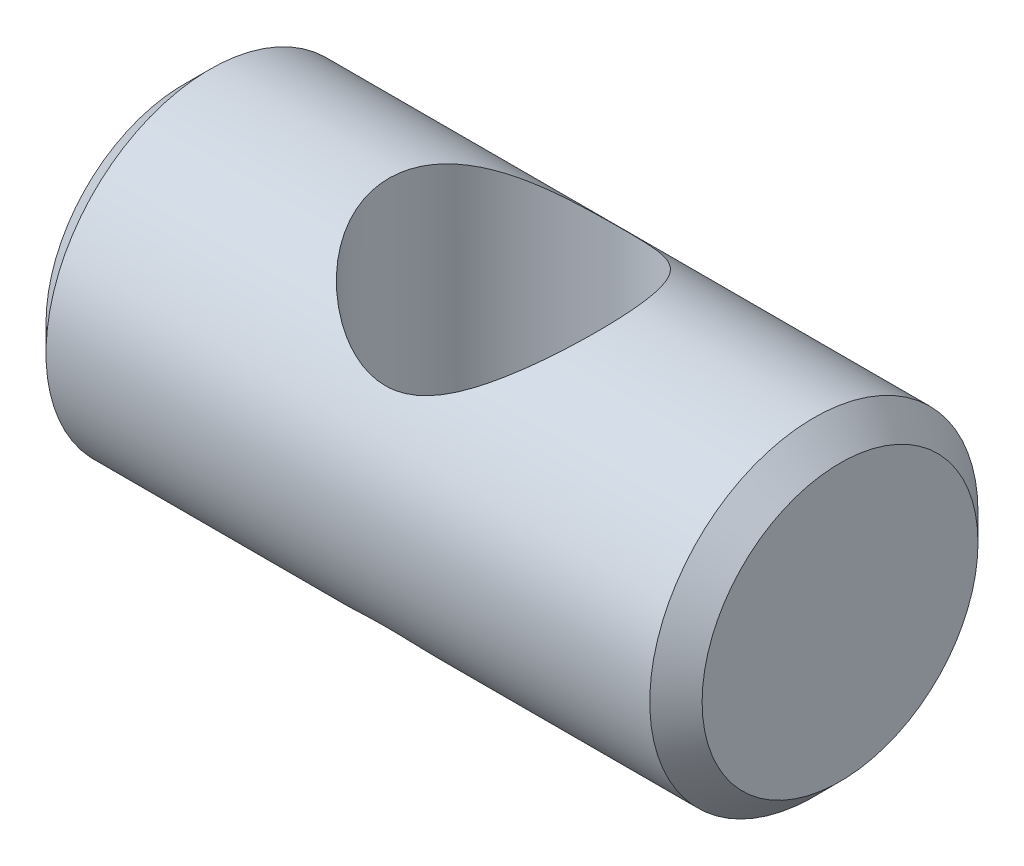
ISO-10303-21;
HEADER;
FILE_DESCRIPTION(('STEP AP214'),'2;1');
FILE_NAME('part.step','',(''),(''),'','','');
FILE_SCHEMA(('AUTOMOTIVE_DESIGN { 1 0 10303 214 1 1 1 1 }'));
ENDSEC;
DATA;
#1=APPLICATION_CONTEXT('core data for automotive mechanical design processes');
#2=APPLICATION_PROTOCOL_DEFINITION('international standard','automotive_design',2000,#1);
#3=PRODUCT_CONTEXT('',#1,'mechanical');
#4=PRODUCT('Part','Part','',(#3));
#5=PRODUCT_RELATED_PRODUCT_CATEGORY('part','',(#4));
#6=PRODUCT_DEFINITION_FORMATION('','',#4);
#7=PRODUCT_DEFINITION_CONTEXT('part definition',#1,'design');
#8=PRODUCT_DEFINITION('design','',#6,#7);
#9=PRODUCT_DEFINITION_SHAPE('','',#8);
#10=(LENGTH_UNIT() NAMED_UNIT(*) SI_UNIT(.MILLI.,.METRE.));
#11=(NAMED_UNIT(*) PLANE_ANGLE_UNIT() SI_UNIT($,.RADIAN.));
#12=(NAMED_UNIT(*) SI_UNIT($,.STERADIAN.) SOLID_ANGLE_UNIT());
#13=UNCERTAINTY_MEASURE_WITH_UNIT(LENGTH_MEASURE(1.E-05),#10,'distance_accuracy_value','');
#14=(GEOMETRIC_REPRESENTATION_CONTEXT(3) GLOBAL_UNCERTAINTY_ASSIGNED_CONTEXT((#13)) GLOBAL_UNIT_ASSIGNED_CONTEXT((#10,
#11,#12)) REPRESENTATION_CONTEXT('',''));
#15=CARTESIAN_POINT('',(0.,0.,0.));
#16=DIRECTION('',(0.,0.,1.));
#17=DIRECTION('',(1.,0.,0.));
#18=AXIS2_PLACEMENT_3D('',#15,#16,#17);
#19=CARTESIAN_POINT('',(9.525,0.,0.));
#20=DIRECTION('',(-1.,0.,0.));
#21=DIRECTION('',(0.,0.,1.));
#22=AXIS2_PLACEMENT_3D('',#19,#20,#21);
#23=CYLINDRICAL_SURFACE('',#22,4.765);
#24=CARTESIAN_POINT('',(0.,-3.0270158572429,3.68));
#25=CARTESIAN_POINT('',(0.0785672773316467,-3.02701614791727,3.67999984364138));
#26=CARTESIAN_POINT('',(0.157136135576355,-3.03031605642996,3.67729277636747));
#27=CARTESIAN_POINT('',(0.313369541449519,-3.04330147157753,3.66655295600809));
#28=CARTESIAN_POINT('',(0.391034010912772,-3.05298752605126,3.65851974601636));
#29=CARTESIAN_POINT('',(0.544942339151607,-3.07820352988238,3.63732812874269));
#30=CARTESIAN_POINT('',(0.621180877977563,-3.09375201630091,3.62415345944192));
#31=CARTESIAN_POINT('',(0.771468880528868,-3.12988210454059,3.59299821855179));
#32=CARTESIAN_POINT('',(0.845516665983408,-3.15046745848851,3.57501406328682));
#33=CARTESIAN_POINT('',(1.09433047382612,-3.22791462831319,3.50587087765695));
#34=CARTESIAN_POINT('',(1.26309282362243,-3.29483865802861,3.44382003292069));
#35=CARTESIAN_POINT('',(1.50370711041474,-3.40467601246938,3.33408533723918));
#36=CARTESIAN_POINT('',(1.58189244838755,-3.44290479326835,3.29468500807197));
#37=CARTESIAN_POINT('',(1.73423285237258,-3.52148653298939,3.21055545325705));
#38=CARTESIAN_POINT('',(1.80838881793449,-3.56183901380659,3.16582742418489));
#39=CARTESIAN_POINT('',(2.02850482582812,-3.68672600847629,3.02153691887044));
#40=CARTESIAN_POINT('',(2.16807869449588,-3.77315168849593,2.91372187409719));
#41=CARTESIAN_POINT('',(2.42959010373284,-3.94426933228633,2.67754924945123));
#42=CARTESIAN_POINT('',(2.55153658554773,-4.02896215617591,2.54920215427041));
#43=CARTESIAN_POINT('',(2.77693730786715,-4.19195052141121,2.27132648174837));
#44=CARTESIAN_POINT('',(2.88023478105728,-4.27018907543985,2.12163570850645));
#45=CARTESIAN_POINT('',(3.06369900830999,-4.41409842691617,1.80316374111448));
#46=CARTESIAN_POINT('',(3.14388622560065,-4.47978032533083,1.63439962117957));
#47=CARTESIAN_POINT('',(3.26635689009236,-4.58439476517905,1.30881127520956));
#48=CARTESIAN_POINT('',(3.3126324755552,-4.62591646772975,1.15433056577145));
#49=CARTESIAN_POINT('',(3.38325654959983,-4.69367027218436,0.83720228083025));
#50=CARTESIAN_POINT('',(3.40762001451853,-4.7199128126465,0.674560363681938));
#51=CARTESIAN_POINT('',(3.43267527752513,-4.75538994748078,0.345016918949483));
#52=CARTESIAN_POINT('',(3.43328564995364,-4.76456593536209,0.178102701594283));
#53=CARTESIAN_POINT('',(3.41018166140548,-4.76540378920208,-0.15408080850447));
#54=CARTESIAN_POINT('',(3.38646547727926,-4.75706434242047,-0.319349977022775));
#55=CARTESIAN_POINT('',(3.31775156953333,-4.72510260499364,-0.634317782486348));
#56=CARTESIAN_POINT('',(3.27397352746067,-4.70233080305011,-0.784375176401479));
#57=CARTESIAN_POINT('',(3.16750864597913,-4.64450941494238,-1.07505429218324));
#58=CARTESIAN_POINT('',(3.10481828431147,-4.60945754152293,-1.21567425043884));
#59=CARTESIAN_POINT('',(2.95652856255593,-4.52638674091888,-1.49677788855974));
#60=CARTESIAN_POINT('',(2.86942133720827,-4.47751111873768,-1.63620711351602));
#61=CARTESIAN_POINT('',(2.67788120319372,-4.37232420780869,-1.89951272145432));
#62=CARTESIAN_POINT('',(2.57343424063936,-4.31600689517522,-2.02337634423389));
#63=CARTESIAN_POINT('',(2.3299298971412,-4.18996971318213,-2.27426780979749));
#64=CARTESIAN_POINT('',(2.18800876851398,-4.11960732735628,-2.39819784816123));
#65=CARTESIAN_POINT('',(1.88505782163776,-3.98107848473248,-2.62174133186739));
#66=CARTESIAN_POINT('',(1.72402241690679,-3.91291267736107,-2.72134764203992));
#67=CARTESIAN_POINT('',(1.40961518716303,-3.79636450990898,-2.881168849186));
#68=CARTESIAN_POINT('',(1.25863725138285,-3.74654731116981,-2.94503209171547));
#69=CARTESIAN_POINT('',(0.945527440392473,-3.66060402226399,-3.05121747931762));
#70=CARTESIAN_POINT('',(0.783414037013451,-3.62445587601066,-3.09357436476774));
#71=CARTESIAN_POINT('',(0.533813056438611,-3.58476149841442,-3.13928376884266));
#72=CARTESIAN_POINT('',(0.449028547115522,-3.57393161480045,-3.15156761613341));
#73=CARTESIAN_POINT('',(0.278275024285709,-3.55780077117141,-3.16976872881678));
#74=CARTESIAN_POINT('',(0.192306660171831,-3.5524968934398,-3.17568935402606));
#75=CARTESIAN_POINT('',(0.0200327709043111,-3.54772147962291,-3.18102355866001));
#76=CARTESIAN_POINT('',(-0.0662726316081485,-3.54824798964232,-3.18043931801256));
#77=CARTESIAN_POINT('',(-0.238338872801629,-3.55508375410915,-3.17279435887041));
#78=CARTESIAN_POINT('',(-0.324099748085627,-3.56139261563451,-3.16573408043507));
#79=CARTESIAN_POINT('',(-0.553401842306177,-3.58576306843395,-3.13816835119393));
#80=CARTESIAN_POINT('',(-0.695739197403444,-3.60894237647337,-3.11173256017326));
#81=CARTESIAN_POINT('',(-0.973480788870411,-3.6678298405413,-3.04208625520151));
#82=CARTESIAN_POINT('',(-1.10887734054378,-3.70355155394913,-2.99885758403296));
#83=CARTESIAN_POINT('',(-1.42379146726814,-3.7997001514418,-2.87675019956371));
#84=CARTESIAN_POINT('',(-1.59919673865542,-3.86428769996493,-2.79052654374781));
#85=CARTESIAN_POINT('',(-1.93113815119942,-4.00059813210694,-2.59133845951309));
#86=CARTESIAN_POINT('',(-2.08764088718698,-4.07233325050109,-2.47832770642991));
#87=CARTESIAN_POINT('',(-2.38199709911893,-4.21579037939226,-2.22570370446708));
#88=CARTESIAN_POINT('',(-2.51955338419097,-4.28749766673045,-2.08573466326166));
#89=CARTESIAN_POINT('',(-2.77028243502778,-4.42234806198233,-1.78201502187867));
#90=CARTESIAN_POINT('',(-2.88349257282064,-4.48550424008068,-1.61830152645775));
#91=CARTESIAN_POINT('',(-3.06402610957439,-4.58658548395503,-1.30045140866569));
#92=CARTESIAN_POINT('',(-3.13591982023922,-4.62699541781642,-1.14970877890861));
#93=CARTESIAN_POINT('',(-3.25766051296821,-4.69370617156705,-0.836599849304391));
#94=CARTESIAN_POINT('',(-3.30752205037566,-4.7200163088041,-0.674241306034808));
#95=CARTESIAN_POINT('',(-3.3829870904449,-4.75572615385405,-0.341241432427484));
#96=CARTESIAN_POINT('',(-3.40846923089666,-4.7650414665297,-0.170563063438746));
#97=CARTESIAN_POINT('',(-3.4334390909829,-4.76495829995348,0.172677006169806));
#98=CARTESIAN_POINT('',(-3.43293306367628,-4.7555643228997,0.345238243758834));
#99=CARTESIAN_POINT('',(-3.40754400048731,-4.71998636563285,0.672126495727839));
#100=CARTESIAN_POINT('',(-3.38468468821344,-4.69525837988108,0.82677947345949));
#101=CARTESIAN_POINT('',(-3.31910619707247,-4.63193340521078,1.12882616508402));
#102=CARTESIAN_POINT('',(-3.27638180384756,-4.59333277548538,1.27621796175837));
#103=CARTESIAN_POINT('',(-3.17042951924722,-4.50215126554465,1.56862605724139));
#104=CARTESIAN_POINT('',(-3.10621371599284,-4.44892473542071,1.71307815224114));
#105=CARTESIAN_POINT('',(-2.96073945861412,-4.33272638873523,1.98874620073681));
#106=CARTESIAN_POINT('',(-2.87947919610232,-4.26975353829207,2.11996074756245));
#107=CARTESIAN_POINT('',(-2.68651050838254,-4.12556821291774,2.39003735747662));
#108=CARTESIAN_POINT('',(-2.57196063848181,-4.04309554925752,2.52618739114482));
#109=CARTESIAN_POINT('',(-2.32447412944917,-3.87408431941462,2.77844859407009));
#110=CARTESIAN_POINT('',(-2.19149095139184,-3.78753584009049,2.89450731580784));
#111=CARTESIAN_POINT('',(-1.96595276183287,-3.65130486353125,3.06263487303052));
#112=CARTESIAN_POINT('',(-1.87886470860019,-3.60090149373494,3.12157066922301));
#113=CARTESIAN_POINT('',(-1.69862262017005,-3.50236607543005,3.23173475735497));
#114=CARTESIAN_POINT('',(-1.60546616441238,-3.45423494663789,3.28295994638551));
#115=CARTESIAN_POINT('',(-1.41335402823624,-3.36225362869259,3.37709887635029));
#116=CARTESIAN_POINT('',(-1.31441341048655,-3.31839304937429,3.4200330530899));
#117=CARTESIAN_POINT('',(-1.11061583662532,-3.23713845030014,3.49704051581634));
#118=CARTESIAN_POINT('',(-1.00576424358737,-3.19973868995705,3.53112168161428));
#119=CARTESIAN_POINT('',(-0.826860618617421,-3.1451674862639,3.57966454279998));
#120=CARTESIAN_POINT('',(-0.754330914941616,-3.12542579098052,3.59686794878708));
#121=CARTESIAN_POINT('',(-0.607204587985837,-3.09080711138969,3.62665947956898));
#122=CARTESIAN_POINT('',(-0.532609008476299,-3.07592771737776,3.63924989089071));
#123=CARTESIAN_POINT('',(-0.382096659839412,-3.05181598122002,3.65949364139542));
#124=CARTESIAN_POINT('',(-0.306185151895194,-3.04256489437812,3.66716337327478));
#125=CARTESIAN_POINT('',(-0.153516252829605,-3.03016475948479,3.67741657137031));
#126=CARTESIAN_POINT('',(-0.0767588809019638,-3.02701557325904,3.68000015275969));
#127=CARTESIAN_POINT('',(0.,-3.0270158572429,3.68));
#128=B_SPLINE_CURVE_WITH_KNOTS('',3,(#24,#25,#26,#27,#28,#29,#30,#31,#32,#33,#34,#35,#36,#37,
#38,#39,#40,#41,#42,#43,#44,#45,#46,#47,#48,#49,#50,#51,#52,#53,#54,#55,#56,#57,#58,#59,#60,#61,
#62,#63,#64,#65,#66,#67,#68,#69,#70,#71,#72,#73,#74,#75,#76,#77,#78,#79,#80,#81,#82,#83,#84,#85,
#86,#87,#88,#89,#90,#91,#92,#93,#94,#95,#96,#97,#98,#99,#100,#101,#102,#103,#104,#105,#106,#107,
#108,#109,#110,#111,#112,#113,#114,#115,#116,#117,#118,#119,#120,#121,#122,#123,#124,#125,#126,
#127),.UNSPECIFIED.,.T.,.F.,(4,2,2,2,2,2,2,2,2,2,2,2,2,2,2,2,2,2,2,2,2,2,2,2,2,2,2,2,2,2,2,2,2,
2,2,2,2,2,2,2,2,2,2,2,2,2,2,2,2,2,2,4),(0.,0.235591708988227,0.471203630963839,
0.707566894291257,0.944106771258298,1.51591397043088,1.80236618274397,2.08875418016066,
2.67592975620557,3.26280644257577,3.85440755326201,4.44548320346413,4.94292664174491,
5.44002983205938,5.93883694376225,6.43768144120932,6.9095606777859,7.38152785217115,
7.89413675044232,8.40716316586385,9.00813916387887,9.60929124216605,10.1214610992978,
10.6328009675269,10.8914987801306,11.1500599316432,11.4085344360666,11.6669913779457,
12.1048085655684,12.5431004643862,13.1573710774192,13.7727118402267,14.3968121302921,
15.0199474601663,15.5333029695888,16.0463188267164,16.5618754223646,17.077307969612,
17.550023970907,18.0228641248864,18.5213957266873,19.0199802486027,19.6062313855034,
20.1939905554461,20.5434646283834,20.8930789631276,21.2418202453876,21.5902500511245,
21.8213124314337,22.0522601254179,22.2824343920731,22.5126034464923),.UNSPECIFIED.);
#129=CARTESIAN_POINT('',(0.,-3.0270158572429,3.68));
#130=VERTEX_POINT('',#129);
#131=EDGE_CURVE('E44',#130,#130,#128,.T.);
#132=ORIENTED_EDGE('',*,*,#131,.T.);
#133=EDGE_LOOP('',(#132));
#134=FACE_BOUND('',#133,.T.);
#135=CARTESIAN_POINT('',(0.,3.0270158572429,3.68));
#136=CARTESIAN_POINT('',(-0.0785672773316464,3.02701614791727,3.67999984364138));
#137=CARTESIAN_POINT('',(-0.157136135576355,3.03031605642997,3.67729277636747));
#138=CARTESIAN_POINT('',(-0.313369541449519,3.04330147157753,3.66655295600809));
#139=CARTESIAN_POINT('',(-0.391034010912771,3.05298752605126,3.65851974601636));
#140=CARTESIAN_POINT('',(-0.544942339151606,3.07820352988238,3.63732812874269));
#141=CARTESIAN_POINT('',(-0.621180877977561,3.09375201630091,3.62415345944192));
#142=CARTESIAN_POINT('',(-0.771468880528866,3.12988210454059,3.59299821855179));
#143=CARTESIAN_POINT('',(-0.845516665983406,3.15046745848851,3.57501406328682));
#144=CARTESIAN_POINT('',(-1.09433047382612,3.22791462831318,3.50587087765695));
#145=CARTESIAN_POINT('',(-1.26309282362243,3.2948386580286,3.44382003292069));
#146=CARTESIAN_POINT('',(-1.50370711041474,3.40467601246938,3.33408533723919));
#147=CARTESIAN_POINT('',(-1.58189244838754,3.44290479326835,3.29468500807198));
#148=CARTESIAN_POINT('',(-1.73423285237257,3.52148653298938,3.21055545325705));
#149=CARTESIAN_POINT('',(-1.80838881793448,3.56183901380659,3.16582742418489));
#150=CARTESIAN_POINT('',(-2.02850482582811,3.68672600847628,3.02153691887044));
#151=CARTESIAN_POINT('',(-2.16807869449587,3.77315168849593,2.9137218740972));
#152=CARTESIAN_POINT('',(-2.42959010373283,3.94426933228633,2.67754924945124));
#153=CARTESIAN_POINT('',(-2.55153658554772,4.0289621561759,2.54920215427042));
#154=CARTESIAN_POINT('',(-2.77693730786714,4.1919505214112,2.27132648174838));
#155=CARTESIAN_POINT('',(-2.88023478105728,4.27018907543984,2.12163570850646));
#156=CARTESIAN_POINT('',(-3.06369900830999,4.41409842691616,1.80316374111449));
#157=CARTESIAN_POINT('',(-3.14388622560065,4.47978032533083,1.63439962117958));
#158=CARTESIAN_POINT('',(-3.26635689009236,4.58439476517905,1.30881127520957));
#159=CARTESIAN_POINT('',(-3.3126324755552,4.62591646772974,1.15433056577145));
#160=CARTESIAN_POINT('',(-3.38325654959983,4.69367027218436,0.837202280830259));
#161=CARTESIAN_POINT('',(-3.40762001451853,4.71991281264649,0.674560363681946));
#162=CARTESIAN_POINT('',(-3.43267527752513,4.75538994748078,0.345016918949491));
#163=CARTESIAN_POINT('',(-3.43328564995364,4.76456593536209,0.17810270159429));
#164=CARTESIAN_POINT('',(-3.41018166140549,4.76540378920208,-0.154080808504463));
#165=CARTESIAN_POINT('',(-3.38646547727926,4.75706434242047,-0.319349977022769));
#166=CARTESIAN_POINT('',(-3.31775156953333,4.72510260499364,-0.634317782486342));
#167=CARTESIAN_POINT('',(-3.27397352746067,4.70233080305011,-0.784375176401474));
#168=CARTESIAN_POINT('',(-3.16750864597913,4.64450941494238,-1.07505429218324));
#169=CARTESIAN_POINT('',(-3.10481828431148,4.60945754152293,-1.21567425043883));
#170=CARTESIAN_POINT('',(-2.95652856255593,4.52638674091888,-1.49677788855974));
#171=CARTESIAN_POINT('',(-2.86942133720828,4.47751111873768,-1.63620711351601));
#172=CARTESIAN_POINT('',(-2.67788120319372,4.37232420780869,-1.89951272145431));
#173=CARTESIAN_POINT('',(-2.57343424063936,4.31600689517522,-2.02337634423388));
#174=CARTESIAN_POINT('',(-2.32992989714121,4.18996971318213,-2.27426780979749));
#175=CARTESIAN_POINT('',(-2.18800876851398,4.11960732735629,-2.39819784816122));
#176=CARTESIAN_POINT('',(-1.88505782163776,3.98107848473248,-2.62174133186739));
#177=CARTESIAN_POINT('',(-1.72402241690679,3.91291267736107,-2.72134764203992));
#178=CARTESIAN_POINT('',(-1.40961518716303,3.79636450990898,-2.881168849186));
#179=CARTESIAN_POINT('',(-1.25863725138286,3.74654731116981,-2.94503209171546));
#180=CARTESIAN_POINT('',(-0.945527440392479,3.66060402226399,-3.05121747931762));
#181=CARTESIAN_POINT('',(-0.783414037013456,3.62445587601066,-3.09357436476774));
#182=CARTESIAN_POINT('',(-0.533813056438615,3.58476149841442,-3.13928376884266));
#183=CARTESIAN_POINT('',(-0.449028547115527,3.57393161480045,-3.15156761613341));
#184=CARTESIAN_POINT('',(-0.278275024285713,3.55780077117141,-3.16976872881678));
#185=CARTESIAN_POINT('',(-0.192306660171836,3.5524968934398,-3.17568935402606));
#186=CARTESIAN_POINT('',(-0.020032770904317,3.54772147962291,-3.18102355866001));
#187=CARTESIAN_POINT('',(0.0662726316081425,3.54824798964232,-3.18043931801256));
#188=CARTESIAN_POINT('',(0.238338872801623,3.55508375410915,-3.17279435887041));
#189=CARTESIAN_POINT('',(0.324099748085622,3.56139261563451,-3.16573408043507));
#190=CARTESIAN_POINT('',(0.553401842306172,3.58576306843395,-3.13816835119393));
#191=CARTESIAN_POINT('',(0.695739197403439,3.60894237647337,-3.11173256017326));
#192=CARTESIAN_POINT('',(0.973480788870407,3.6678298405413,-3.04208625520151));
#193=CARTESIAN_POINT('',(1.10887734054378,3.70355155394912,-2.99885758403296));
#194=CARTESIAN_POINT('',(1.42379146726814,3.7997001514418,-2.87675019956372));
#195=CARTESIAN_POINT('',(1.59919673865541,3.86428769996493,-2.79052654374781));
#196=CARTESIAN_POINT('',(1.93113815119942,4.00059813210694,-2.59133845951309));
#197=CARTESIAN_POINT('',(2.08764088718698,4.07233325050109,-2.47832770642991));
#198=CARTESIAN_POINT('',(2.38199709911893,4.21579037939226,-2.22570370446708));
#199=CARTESIAN_POINT('',(2.51955338419097,4.28749766673045,-2.08573466326166));
#200=CARTESIAN_POINT('',(2.77028243502778,4.42234806198233,-1.78201502187868));
#201=CARTESIAN_POINT('',(2.88349257282064,4.48550424008068,-1.61830152645775));
#202=CARTESIAN_POINT('',(3.06402610957439,4.58658548395503,-1.30045140866569));
#203=CARTESIAN_POINT('',(3.13591982023922,4.62699541781642,-1.14970877890861));
#204=CARTESIAN_POINT('',(3.25766051296821,4.69370617156705,-0.836599849304392));
#205=CARTESIAN_POINT('',(3.30752205037566,4.7200163088041,-0.674241306034809));
#206=CARTESIAN_POINT('',(3.3829870904449,4.75572615385405,-0.341241432427484));
#207=CARTESIAN_POINT('',(3.40846923089666,4.7650414665297,-0.170563063438745));
#208=CARTESIAN_POINT('',(3.4334390909829,4.76495829995348,0.172677006169808));
#209=CARTESIAN_POINT('',(3.43293306367628,4.7555643228997,0.345238243758834));
#210=CARTESIAN_POINT('',(3.40754400048731,4.71998636563285,0.672126495727838));
#211=CARTESIAN_POINT('',(3.38468468821344,4.69525837988108,0.826779473459489));
#212=CARTESIAN_POINT('',(3.31910619707247,4.63193340521078,1.12882616508402));
#213=CARTESIAN_POINT('',(3.27638180384756,4.59333277548538,1.27621796175837));
#214=CARTESIAN_POINT('',(3.17042951924722,4.50215126554465,1.56862605724139));
#215=CARTESIAN_POINT('',(3.10621371599284,4.44892473542071,1.71307815224114));
#216=CARTESIAN_POINT('',(2.96073945861412,4.33272638873524,1.98874620073681));
#217=CARTESIAN_POINT('',(2.87947919610232,4.26975353829207,2.11996074756244));
#218=CARTESIAN_POINT('',(2.68651050838254,4.12556821291774,2.39003735747662));
#219=CARTESIAN_POINT('',(2.57196063848181,4.04309554925752,2.52618739114482));
#220=CARTESIAN_POINT('',(2.32447412944917,3.87408431941462,2.77844859407009));
#221=CARTESIAN_POINT('',(2.19149095139184,3.78753584009048,2.89450731580785));
#222=CARTESIAN_POINT('',(1.96595276183288,3.65130486353125,3.06263487303052));
#223=CARTESIAN_POINT('',(1.87886470860019,3.60090149373494,3.12157066922301));
#224=CARTESIAN_POINT('',(1.69862262017005,3.50236607543005,3.23173475735497));
#225=CARTESIAN_POINT('',(1.60546616441238,3.45423494663789,3.28295994638551));
#226=CARTESIAN_POINT('',(1.41335402823624,3.36225362869259,3.37709887635029));
#227=CARTESIAN_POINT('',(1.31441341048655,3.31839304937429,3.42003305308989));
#228=CARTESIAN_POINT('',(1.11061583662532,3.23713845030014,3.49704051581634));
#229=CARTESIAN_POINT('',(1.00576424358737,3.19973868995705,3.53112168161428));
#230=CARTESIAN_POINT('',(0.826860618617422,3.1451674862639,3.57966454279998));
#231=CARTESIAN_POINT('',(0.754330914941616,3.12542579098052,3.59686794878708));
#232=CARTESIAN_POINT('',(0.607204587985838,3.09080711138969,3.62665947956898));
#233=CARTESIAN_POINT('',(0.5326090084763,3.07592771737776,3.63924989089071));
#234=CARTESIAN_POINT('',(0.382096659839413,3.05181598122002,3.65949364139542));
#235=CARTESIAN_POINT('',(0.306185151895194,3.04256489437812,3.66716337327478));
#236=CARTESIAN_POINT('',(0.153516252829605,3.03016475948479,3.67741657137031));
#237=CARTESIAN_POINT('',(0.0767588809019638,3.02701557325904,3.68000015275969));
#238=CARTESIAN_POINT('',(0.,3.0270158572429,3.68));
#239=B_SPLINE_CURVE_WITH_KNOTS('',3,(#135,#136,#137,#138,#139,#140,#141,#142,#143,#144,#145,
#146,#147,#148,#149,#150,#151,#152,#153,#154,#155,#156,#157,#158,#159,#160,#161,#162,#163,#164,
#165,#166,#167,#168,#169,#170,#171,#172,#173,#174,#175,#176,#177,#178,#179,#180,#181,#182,#183,
#184,#185,#186,#187,#188,#189,#190,#191,#192,#193,#194,#195,#196,#197,#198,#199,#200,#201,#202,
#203,#204,#205,#206,#207,#208,#209,#210,#211,#212,#213,#214,#215,#216,#217,#218,#219,#220,#221,
#222,#223,#224,#225,#226,#227,#228,#229,#230,#231,#232,#233,#234,#235,#236,#237,#238),
.UNSPECIFIED.,.T.,.F.,(4,2,2,2,2,2,2,2,2,2,2,2,2,2,2,2,2,2,2,2,2,2,2,2,2,2,2,2,2,2,2,2,2,2,2,2,
2,2,2,2,2,2,2,2,2,2,2,2,2,2,2,4),(0.,0.235591708988226,0.471203630963838,0.707566894291255,
0.944106771258295,1.51591397043087,1.80236618274396,2.08875418016066,2.67592975620556,
3.26280644257576,3.854407553262,4.44548320346412,4.9429266417449,5.44002983205937,
5.93883694376224,6.43768144120931,6.9095606777859,7.38152785217115,7.89413675044232,
8.40716316586385,9.00813916387887,9.60929124216605,10.1214610992978,10.6328009675269,
10.8914987801306,11.1500599316432,11.4085344360666,11.6669913779457,12.1048085655684,
12.5431004643861,13.1573710774192,13.7727118402267,14.3968121302921,15.0199474601663,
15.5333029695888,16.0463188267164,16.5618754223646,17.077307969612,17.550023970907,
18.0228641248864,18.5213957266873,19.0199802486027,19.6062313855034,20.1939905554461,
20.5434646283834,20.8930789631276,21.2418202453876,21.5902500511245,21.8213124314337,
22.0522601254179,22.2824343920731,22.5126034464923),.UNSPECIFIED.);
#240=CARTESIAN_POINT('',(0.,3.0270158572429,3.68));
#241=VERTEX_POINT('',#240);
#242=EDGE_CURVE('E63',#241,#241,#239,.T.);
#243=ORIENTED_EDGE('',*,*,#242,.T.);
#244=EDGE_LOOP('',(#243));
#245=FACE_BOUND('',#244,.T.);
#246=CARTESIAN_POINT('',(-8.76499999999999,0.,0.));
#247=DIRECTION('',(1.,0.,0.));
#248=DIRECTION('',(0.,0.,-1.));
#249=AXIS2_PLACEMENT_3D('',#246,#247,#248);
#250=CIRCLE('',#249,4.765);
#251=CARTESIAN_POINT('',(-8.76499999999999,0.,-4.765));
#252=VERTEX_POINT('',#251);
#253=EDGE_CURVE('E60',#252,#252,#250,.T.);
#254=ORIENTED_EDGE('',*,*,#253,.T.);
#255=EDGE_LOOP('',(#254));
#256=FACE_BOUND('',#255,.T.);
#257=CARTESIAN_POINT('',(8.76500000000001,0.,0.));
#258=DIRECTION('',(1.,0.,0.));
#259=DIRECTION('',(0.,0.,-1.));
#260=AXIS2_PLACEMENT_3D('',#257,#258,#259);
#261=CIRCLE('',#260,4.765);
#262=CARTESIAN_POINT('',(8.76500000000001,0.,-4.765));
#263=VERTEX_POINT('',#262);
#264=EDGE_CURVE('E101',#263,#263,#261,.F.);
#265=ORIENTED_EDGE('',*,*,#264,.T.);
#266=EDGE_LOOP('',(#265));
#267=FACE_BOUND('',#266,.T.);
#268=ADVANCED_FACE('F39',(#134,#245,#256,#267),#23,.T.);
#269=CARTESIAN_POINT('',(9.525,0.,0.));
#270=DIRECTION('',(1.,0.,0.));
#271=DIRECTION('',(0.,0.,-1.));
#272=AXIS2_PLACEMENT_3D('',#269,#270,#271);
#273=PLANE('',#272);
#274=CARTESIAN_POINT('',(9.525,0.,0.));
#275=DIRECTION('',(1.,0.,0.));
#276=DIRECTION('',(0.,0.,-1.));
#277=AXIS2_PLACEMENT_3D('',#274,#275,#276);
#278=CIRCLE('',#277,4.00500000000001);
#279=CARTESIAN_POINT('',(9.525,0.,-4.00500000000001));
#280=VERTEX_POINT('',#279);
#281=EDGE_CURVE('E10',#280,#280,#278,.T.);
#282=ORIENTED_EDGE('',*,*,#281,.T.);
#283=EDGE_LOOP('',(#282));
#284=FACE_BOUND('',#283,.T.);
#285=ADVANCED_FACE('F76',(#284),#273,.T.);
#286=CARTESIAN_POINT('',(-9.525,0.,0.));
#287=DIRECTION('',(1.,0.,0.));
#288=DIRECTION('',(0.,0.,-1.));
#289=AXIS2_PLACEMENT_3D('',#286,#287,#288);
#290=PLANE('',#289);
#291=CARTESIAN_POINT('',(-9.525,0.,0.));
#292=DIRECTION('',(1.,0.,0.));
#293=DIRECTION('',(0.,0.,-1.));
#294=AXIS2_PLACEMENT_3D('',#291,#292,#293);
#295=CIRCLE('',#294,4.00499999999998);
#296=CARTESIAN_POINT('',(-9.525,0.,-4.00499999999998));
#297=VERTEX_POINT('',#296);
#298=EDGE_CURVE('E54',#297,#297,#295,.F.);
#299=ORIENTED_EDGE('',*,*,#298,.T.);
#300=EDGE_LOOP('',(#299));
#301=FACE_BOUND('',#300,.T.);
#302=ADVANCED_FACE('F79',(#301),#290,.F.);
#303=CARTESIAN_POINT('',(-8.76499999999999,0.,0.));
#304=DIRECTION('',(1.,0.,0.));
#305=DIRECTION('',(0.,0.,-1.));
#306=AXIS2_PLACEMENT_3D('',#303,#304,#305);
#307=CONICAL_SURFACE('',#306,4.765,0.785398163397451);
#308=ORIENTED_EDGE('',*,*,#298,.F.);
#309=EDGE_LOOP('',(#308));
#310=FACE_BOUND('',#309,.T.);
#311=ORIENTED_EDGE('',*,*,#253,.F.);
#312=EDGE_LOOP('',(#311));
#313=FACE_BOUND('',#312,.T.);
#314=ADVANCED_FACE('F81',(#310,#313),#307,.T.);
#315=CARTESIAN_POINT('',(9.525,0.,0.));
#316=DIRECTION('',(-1.,0.,0.));
#317=DIRECTION('',(0.,0.,1.));
#318=AXIS2_PLACEMENT_3D('',#315,#316,#317);
#319=CONICAL_SURFACE('',#318,4.00500000000001,0.785398163397448);
#320=ORIENTED_EDGE('',*,*,#264,.F.);
#321=EDGE_LOOP('',(#320));
#322=FACE_BOUND('',#321,.T.);
#323=ORIENTED_EDGE('',*,*,#281,.F.);
#324=EDGE_LOOP('',(#323));
#325=FACE_BOUND('',#324,.T.);
#326=ADVANCED_FACE('F42',(#322,#325),#319,.T.);
#327=CARTESIAN_POINT('',(0.,-9.525,0.25));
#328=DIRECTION('',(0.,1.,0.));
#329=DIRECTION('',(0.,0.,1.));
#330=AXIS2_PLACEMENT_3D('',#327,#328,#329);
#331=CYLINDRICAL_SURFACE('',#330,3.43);
#332=ORIENTED_EDGE('',*,*,#242,.F.);
#333=EDGE_LOOP('',(#332));
#334=FACE_BOUND('',#333,.T.);
#335=ORIENTED_EDGE('',*,*,#131,.F.);
#336=EDGE_LOOP('',(#335));
#337=FACE_BOUND('',#336,.T.);
#338=ADVANCED_FACE('F71',(#334,#337),#331,.F.);
#339=CLOSED_SHELL('',(#268,#285,#302,#314,#326,#338));
#340=MANIFOLD_SOLID_BREP('B2',#339);
#341=ADVANCED_BREP_SHAPE_REPRESENTATION('',(#18,#340),#14);
#342=SHAPE_DEFINITION_REPRESENTATION(#9,#341);
ENDSEC;
END-ISO-10303-21;
